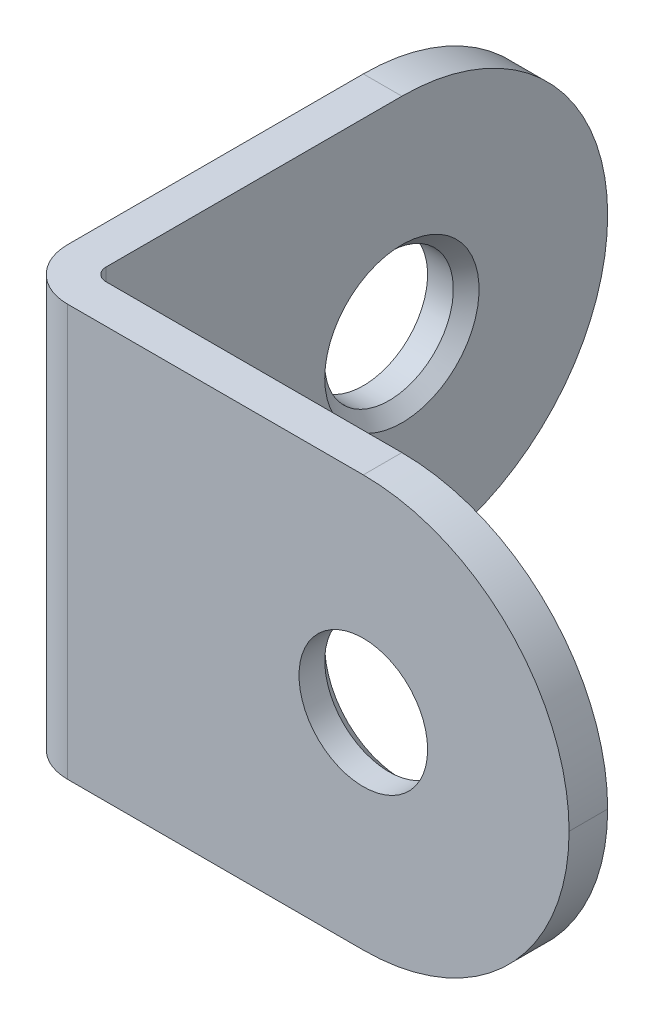
ISO-10303-21;
HEADER;
FILE_DESCRIPTION(('STEP AP214'),'2;1');
FILE_NAME('part.step','',(''),(''),'','','');
FILE_SCHEMA(('AUTOMOTIVE_DESIGN { 1 0 10303 214 1 1 1 1 }'));
ENDSEC;
DATA;
#1=APPLICATION_CONTEXT('core data for automotive mechanical design processes');
#2=APPLICATION_PROTOCOL_DEFINITION('international standard','automotive_design',2000,#1);
#3=PRODUCT_CONTEXT('',#1,'mechanical');
#4=PRODUCT('Part','Part','',(#3));
#5=PRODUCT_RELATED_PRODUCT_CATEGORY('part','',(#4));
#6=PRODUCT_DEFINITION_FORMATION('','',#4);
#7=PRODUCT_DEFINITION_CONTEXT('part definition',#1,'design');
#8=PRODUCT_DEFINITION('design','',#6,#7);
#9=PRODUCT_DEFINITION_SHAPE('','',#8);
#10=(LENGTH_UNIT() NAMED_UNIT(*) SI_UNIT(.MILLI.,.METRE.));
#11=(NAMED_UNIT(*) PLANE_ANGLE_UNIT() SI_UNIT($,.RADIAN.));
#12=(NAMED_UNIT(*) SI_UNIT($,.STERADIAN.) SOLID_ANGLE_UNIT());
#13=UNCERTAINTY_MEASURE_WITH_UNIT(LENGTH_MEASURE(1.E-05),#10,'distance_accuracy_value','');
#14=(GEOMETRIC_REPRESENTATION_CONTEXT(3) GLOBAL_UNCERTAINTY_ASSIGNED_CONTEXT((#13)) GLOBAL_UNIT_ASSIGNED_CONTEXT((#10,
#11,#12)) REPRESENTATION_CONTEXT('',''));
#15=CARTESIAN_POINT('',(0.,0.,0.));
#16=DIRECTION('',(0.,0.,1.));
#17=DIRECTION('',(1.,0.,0.));
#18=AXIS2_PLACEMENT_3D('',#15,#16,#17);
#19=CARTESIAN_POINT('',(-1.5,16.,-20.));
#20=DIRECTION('',(1.,0.,0.));
#21=DIRECTION('',(0.,0.,-1.));
#22=AXIS2_PLACEMENT_3D('',#19,#20,#21);
#23=PLANE('',#22);
#24=CARTESIAN_POINT('',(-1.5,8.,-12.));
#25=DIRECTION('',(-1.,0.,0.));
#26=DIRECTION('',(0.,0.,1.));
#27=AXIS2_PLACEMENT_3D('',#24,#25,#26);
#28=CIRCLE('',#27,2.5);
#29=CARTESIAN_POINT('',(-1.5,8.,-9.5));
#30=VERTEX_POINT('',#29);
#31=EDGE_CURVE('E312',#30,#30,#28,.T.);
#32=ORIENTED_EDGE('',*,*,#31,.F.);
#33=EDGE_LOOP('',(#32));
#34=FACE_BOUND('',#33,.T.);
#35=DIRECTION('',(0.,0.,1.));
#36=VECTOR('',#35,1.);
#37=CARTESIAN_POINT('',(-1.5,0.,-20.));
#38=LINE('',#37,#36);
#39=CARTESIAN_POINT('',(-1.5,0.,-12.));
#40=VERTEX_POINT('',#39);
#41=CARTESIAN_POINT('',(-1.5,0.,-0.5));
#42=VERTEX_POINT('',#41);
#43=EDGE_CURVE('E127',#40,#42,#38,.T.);
#44=ORIENTED_EDGE('',*,*,#43,.T.);
#45=DIRECTION('',(0.,-1.,0.));
#46=VECTOR('',#45,1.);
#47=CARTESIAN_POINT('',(-1.5,16.,-0.5));
#48=LINE('',#47,#46);
#49=CARTESIAN_POINT('',(-1.5,16.,-0.5));
#50=VERTEX_POINT('',#49);
#51=EDGE_CURVE('E195',#42,#50,#48,.F.);
#52=ORIENTED_EDGE('',*,*,#51,.T.);
#53=DIRECTION('',(0.,0.,1.));
#54=VECTOR('',#53,1.);
#55=CARTESIAN_POINT('',(-1.5,16.,-20.));
#56=LINE('',#55,#54);
#57=CARTESIAN_POINT('',(-1.5,16.,-12.));
#58=VERTEX_POINT('',#57);
#59=EDGE_CURVE('E303',#58,#50,#56,.T.);
#60=ORIENTED_EDGE('',*,*,#59,.F.);
#61=CARTESIAN_POINT('',(-1.5,8.,-12.));
#62=DIRECTION('',(1.,0.,0.));
#63=DIRECTION('',(0.,0.,-1.));
#64=AXIS2_PLACEMENT_3D('',#61,#62,#63);
#65=CIRCLE('',#64,8.);
#66=CARTESIAN_POINT('',(-1.5,8.,-20.));
#67=VERTEX_POINT('',#66);
#68=EDGE_CURVE('E131',#58,#67,#65,.F.);
#69=ORIENTED_EDGE('',*,*,#68,.T.);
#70=CARTESIAN_POINT('',(-1.5,8.,-12.));
#71=DIRECTION('',(1.,0.,0.));
#72=DIRECTION('',(0.,0.,-1.));
#73=AXIS2_PLACEMENT_3D('',#70,#71,#72);
#74=CIRCLE('',#73,8.);
#75=EDGE_CURVE('E125',#67,#40,#74,.F.);
#76=ORIENTED_EDGE('',*,*,#75,.T.);
#77=EDGE_LOOP('',(#44,#52,#60,#69,#76));
#78=FACE_BOUND('',#77,.T.);
#79=ADVANCED_FACE('F44',(#34,#78),#23,.F.);
#80=CARTESIAN_POINT('',(-1.5,16.,1.5));
#81=DIRECTION('',(0.,0.,-1.));
#82=DIRECTION('',(-1.,0.,0.));
#83=AXIS2_PLACEMENT_3D('',#80,#81,#82);
#84=PLANE('',#83);
#85=CARTESIAN_POINT('',(12.,8.,1.5));
#86=DIRECTION('',(0.,0.,1.));
#87=DIRECTION('',(1.,0.,0.));
#88=AXIS2_PLACEMENT_3D('',#85,#86,#87);
#89=CIRCLE('',#88,2.5);
#90=CARTESIAN_POINT('',(14.5,8.,1.5));
#91=VERTEX_POINT('',#90);
#92=EDGE_CURVE('E189',#91,#91,#89,.T.);
#93=ORIENTED_EDGE('',*,*,#92,.F.);
#94=EDGE_LOOP('',(#93));
#95=FACE_BOUND('',#94,.T.);
#96=DIRECTION('',(1.,0.,0.));
#97=VECTOR('',#96,1.);
#98=CARTESIAN_POINT('',(-1.5,16.,1.5));
#99=LINE('',#98,#97);
#100=CARTESIAN_POINT('',(0.499999999999998,16.,1.5));
#101=VERTEX_POINT('',#100);
#102=CARTESIAN_POINT('',(12.,16.,1.5));
#103=VERTEX_POINT('',#102);
#104=EDGE_CURVE('E292',#101,#103,#99,.T.);
#105=ORIENTED_EDGE('',*,*,#104,.F.);
#106=DIRECTION('',(0.,-1.,0.));
#107=VECTOR('',#106,1.);
#108=CARTESIAN_POINT('',(0.499999999999998,16.,1.5));
#109=LINE('',#108,#107);
#110=CARTESIAN_POINT('',(0.499999999999998,0.,1.5));
#111=VERTEX_POINT('',#110);
#112=EDGE_CURVE('E182',#101,#111,#109,.T.);
#113=ORIENTED_EDGE('',*,*,#112,.T.);
#114=DIRECTION('',(1.,0.,0.));
#115=VECTOR('',#114,1.);
#116=CARTESIAN_POINT('',(-1.5,0.,1.5));
#117=LINE('',#116,#115);
#118=CARTESIAN_POINT('',(12.,0.,1.5));
#119=VERTEX_POINT('',#118);
#120=EDGE_CURVE('E145',#111,#119,#117,.T.);
#121=ORIENTED_EDGE('',*,*,#120,.T.);
#122=CARTESIAN_POINT('',(12.,8.,1.5));
#123=DIRECTION('',(0.,0.,-1.));
#124=DIRECTION('',(-1.,0.,0.));
#125=AXIS2_PLACEMENT_3D('',#122,#123,#124);
#126=CIRCLE('',#125,8.);
#127=CARTESIAN_POINT('',(20.,8.,1.5));
#128=VERTEX_POINT('',#127);
#129=EDGE_CURVE('E179',#119,#128,#126,.F.);
#130=ORIENTED_EDGE('',*,*,#129,.T.);
#131=CARTESIAN_POINT('',(12.,8.,1.5));
#132=DIRECTION('',(0.,0.,-1.));
#133=DIRECTION('',(-1.,0.,0.));
#134=AXIS2_PLACEMENT_3D('',#131,#132,#133);
#135=CIRCLE('',#134,8.);
#136=EDGE_CURVE('E175',#128,#103,#135,.F.);
#137=ORIENTED_EDGE('',*,*,#136,.T.);
#138=EDGE_LOOP('',(#105,#113,#121,#130,#137));
#139=FACE_BOUND('',#138,.T.);
#140=ADVANCED_FACE('F235',(#95,#139),#84,.F.);
#141=CARTESIAN_POINT('',(0.,16.,0.));
#142=DIRECTION('',(0.,0.,1.));
#143=DIRECTION('',(1.,0.,0.));
#144=AXIS2_PLACEMENT_3D('',#141,#142,#143);
#145=PLANE('',#144);
#146=CARTESIAN_POINT('',(12.,8.,0.));
#147=DIRECTION('',(0.,0.,1.));
#148=DIRECTION('',(1.,0.,0.));
#149=AXIS2_PLACEMENT_3D('',#146,#147,#148);
#150=CIRCLE('',#149,3.);
#151=CARTESIAN_POINT('',(15.,8.,0.));
#152=VERTEX_POINT('',#151);
#153=EDGE_CURVE('E54',#152,#152,#150,.T.);
#154=ORIENTED_EDGE('',*,*,#153,.T.);
#155=EDGE_LOOP('',(#154));
#156=FACE_BOUND('',#155,.T.);
#157=DIRECTION('',(-1.,0.,0.));
#158=VECTOR('',#157,1.);
#159=CARTESIAN_POINT('',(0.,0.,0.));
#160=LINE('',#159,#158);
#161=CARTESIAN_POINT('',(12.,0.,0.));
#162=VERTEX_POINT('',#161);
#163=CARTESIAN_POINT('',(0.5,0.,0.));
#164=VERTEX_POINT('',#163);
#165=EDGE_CURVE('E298',#162,#164,#160,.T.);
#166=ORIENTED_EDGE('',*,*,#165,.T.);
#167=DIRECTION('',(0.,-1.,0.));
#168=VECTOR('',#167,1.);
#169=CARTESIAN_POINT('',(0.5,16.,0.));
#170=LINE('',#169,#168);
#171=CARTESIAN_POINT('',(0.5,16.,0.));
#172=VERTEX_POINT('',#171);
#173=EDGE_CURVE('E61',#164,#172,#170,.F.);
#174=ORIENTED_EDGE('',*,*,#173,.T.);
#175=DIRECTION('',(-1.,0.,0.));
#176=VECTOR('',#175,1.);
#177=CARTESIAN_POINT('',(0.,16.,0.));
#178=LINE('',#177,#176);
#179=CARTESIAN_POINT('',(12.,16.,0.));
#180=VERTEX_POINT('',#179);
#181=EDGE_CURVE('E282',#180,#172,#178,.T.);
#182=ORIENTED_EDGE('',*,*,#181,.F.);
#183=CARTESIAN_POINT('',(12.,8.,0.));
#184=DIRECTION('',(0.,0.,1.));
#185=DIRECTION('',(1.,0.,0.));
#186=AXIS2_PLACEMENT_3D('',#183,#184,#185);
#187=CIRCLE('',#186,8.);
#188=CARTESIAN_POINT('',(20.,8.,0.));
#189=VERTEX_POINT('',#188);
#190=EDGE_CURVE('E169',#180,#189,#187,.F.);
#191=ORIENTED_EDGE('',*,*,#190,.T.);
#192=CARTESIAN_POINT('',(12.,8.,0.));
#193=DIRECTION('',(0.,0.,1.));
#194=DIRECTION('',(1.,0.,0.));
#195=AXIS2_PLACEMENT_3D('',#192,#193,#194);
#196=CIRCLE('',#195,8.);
#197=EDGE_CURVE('E172',#189,#162,#196,.F.);
#198=ORIENTED_EDGE('',*,*,#197,.T.);
#199=EDGE_LOOP('',(#166,#174,#182,#191,#198));
#200=FACE_BOUND('',#199,.T.);
#201=ADVANCED_FACE('F223',(#156,#200),#145,.F.);
#202=CARTESIAN_POINT('',(0.,16.,-20.));
#203=DIRECTION('',(-1.,0.,0.));
#204=DIRECTION('',(0.,0.,1.));
#205=AXIS2_PLACEMENT_3D('',#202,#203,#204);
#206=PLANE('',#205);
#207=CARTESIAN_POINT('',(0.,8.,-12.));
#208=DIRECTION('',(-1.,0.,0.));
#209=DIRECTION('',(0.,0.,1.));
#210=AXIS2_PLACEMENT_3D('',#207,#208,#209);
#211=CIRCLE('',#210,2.99999999999999);
#212=CARTESIAN_POINT('',(0.,8.,-9.00000000000001));
#213=VERTEX_POINT('',#212);
#214=EDGE_CURVE('E212',#213,#213,#211,.T.);
#215=ORIENTED_EDGE('',*,*,#214,.T.);
#216=EDGE_LOOP('',(#215));
#217=FACE_BOUND('',#216,.T.);
#218=DIRECTION('',(0.,0.,-1.));
#219=VECTOR('',#218,1.);
#220=CARTESIAN_POINT('',(0.,16.,-20.));
#221=LINE('',#220,#219);
#222=CARTESIAN_POINT('',(0.,16.,-0.5));
#223=VERTEX_POINT('',#222);
#224=CARTESIAN_POINT('',(0.,16.,-12.));
#225=VERTEX_POINT('',#224);
#226=EDGE_CURVE('E281',#223,#225,#221,.T.);
#227=ORIENTED_EDGE('',*,*,#226,.F.);
#228=DIRECTION('',(0.,-1.,0.));
#229=VECTOR('',#228,1.);
#230=CARTESIAN_POINT('',(0.,0.,-0.5));
#231=LINE('',#230,#229);
#232=CARTESIAN_POINT('',(0.,0.,-0.5));
#233=VERTEX_POINT('',#232);
#234=EDGE_CURVE('E201',#223,#233,#231,.T.);
#235=ORIENTED_EDGE('',*,*,#234,.T.);
#236=DIRECTION('',(0.,0.,-1.));
#237=VECTOR('',#236,1.);
#238=CARTESIAN_POINT('',(0.,0.,-20.));
#239=LINE('',#238,#237);
#240=CARTESIAN_POINT('',(0.,0.,-12.));
#241=VERTEX_POINT('',#240);
#242=EDGE_CURVE('E301',#233,#241,#239,.T.);
#243=ORIENTED_EDGE('',*,*,#242,.T.);
#244=CARTESIAN_POINT('',(0.,8.,-12.));
#245=DIRECTION('',(-1.,0.,0.));
#246=DIRECTION('',(0.,0.,1.));
#247=AXIS2_PLACEMENT_3D('',#244,#245,#246);
#248=CIRCLE('',#247,8.);
#249=CARTESIAN_POINT('',(0.,8.,-20.));
#250=VERTEX_POINT('',#249);
#251=EDGE_CURVE('E150',#241,#250,#248,.F.);
#252=ORIENTED_EDGE('',*,*,#251,.T.);
#253=CARTESIAN_POINT('',(0.,8.,-12.));
#254=DIRECTION('',(-1.,0.,0.));
#255=DIRECTION('',(0.,0.,1.));
#256=AXIS2_PLACEMENT_3D('',#253,#254,#255);
#257=CIRCLE('',#256,8.);
#258=EDGE_CURVE('E152',#250,#225,#257,.F.);
#259=ORIENTED_EDGE('',*,*,#258,.T.);
#260=EDGE_LOOP('',(#227,#235,#243,#252,#259));
#261=FACE_BOUND('',#260,.T.);
#262=ADVANCED_FACE('F284',(#217,#261),#206,.F.);
#263=CARTESIAN_POINT('',(0.,16.,0.));
#264=DIRECTION('',(0.,-1.,0.));
#265=DIRECTION('',(0.,0.,-1.));
#266=AXIS2_PLACEMENT_3D('',#263,#264,#265);
#267=PLANE('',#266);
#268=ORIENTED_EDGE('',*,*,#59,.T.);
#269=CARTESIAN_POINT('',(0.499999999999998,16.,-0.5));
#270=DIRECTION('',(0.,-1.,0.));
#271=DIRECTION('',(0.,0.,-1.));
#272=AXIS2_PLACEMENT_3D('',#269,#270,#271);
#273=CIRCLE('',#272,2.);
#274=EDGE_CURVE('E198',#50,#101,#273,.F.);
#275=ORIENTED_EDGE('',*,*,#274,.T.);
#276=ORIENTED_EDGE('',*,*,#104,.T.);
#277=DIRECTION('',(0.,0.,-1.));
#278=VECTOR('',#277,1.);
#279=CARTESIAN_POINT('',(12.,16.,0.));
#280=LINE('',#279,#278);
#281=EDGE_CURVE('E163',#103,#180,#280,.T.);
#282=ORIENTED_EDGE('',*,*,#281,.T.);
#283=ORIENTED_EDGE('',*,*,#181,.T.);
#284=CARTESIAN_POINT('',(0.5,16.,-0.5));
#285=DIRECTION('',(0.,-1.,0.));
#286=DIRECTION('',(0.,0.,-1.));
#287=AXIS2_PLACEMENT_3D('',#284,#285,#286);
#288=CIRCLE('',#287,0.5);
#289=EDGE_CURVE('E209',#172,#223,#288,.T.);
#290=ORIENTED_EDGE('',*,*,#289,.T.);
#291=ORIENTED_EDGE('',*,*,#226,.T.);
#292=DIRECTION('',(-1.,0.,0.));
#293=VECTOR('',#292,1.);
#294=CARTESIAN_POINT('',(0.,16.,-12.));
#295=LINE('',#294,#293);
#296=EDGE_CURVE('E166',#225,#58,#295,.T.);
#297=ORIENTED_EDGE('',*,*,#296,.T.);
#298=EDGE_LOOP('',(#268,#275,#276,#282,#283,#290,#291,#297));
#299=FACE_BOUND('',#298,.T.);
#300=ADVANCED_FACE('F280',(#299),#267,.F.);
#301=CARTESIAN_POINT('',(0.,0.,0.));
#302=DIRECTION('',(0.,-1.,0.));
#303=DIRECTION('',(0.,0.,-1.));
#304=AXIS2_PLACEMENT_3D('',#301,#302,#303);
#305=PLANE('',#304);
#306=ORIENTED_EDGE('',*,*,#120,.F.);
#307=CARTESIAN_POINT('',(0.499999999999998,0.,-0.5));
#308=DIRECTION('',(0.,-1.,0.));
#309=DIRECTION('',(0.,0.,-1.));
#310=AXIS2_PLACEMENT_3D('',#307,#308,#309);
#311=CIRCLE('',#310,2.);
#312=EDGE_CURVE('E143',#111,#42,#311,.T.);
#313=ORIENTED_EDGE('',*,*,#312,.T.);
#314=ORIENTED_EDGE('',*,*,#43,.F.);
#315=DIRECTION('',(-1.,0.,0.));
#316=VECTOR('',#315,1.);
#317=CARTESIAN_POINT('',(0.,0.,-12.));
#318=LINE('',#317,#316);
#319=EDGE_CURVE('E142',#40,#241,#318,.F.);
#320=ORIENTED_EDGE('',*,*,#319,.T.);
#321=ORIENTED_EDGE('',*,*,#242,.F.);
#322=CARTESIAN_POINT('',(0.5,0.,-0.5));
#323=DIRECTION('',(0.,-1.,0.));
#324=DIRECTION('',(0.,0.,-1.));
#325=AXIS2_PLACEMENT_3D('',#322,#323,#324);
#326=CIRCLE('',#325,0.5);
#327=EDGE_CURVE('E69',#233,#164,#326,.F.);
#328=ORIENTED_EDGE('',*,*,#327,.T.);
#329=ORIENTED_EDGE('',*,*,#165,.F.);
#330=DIRECTION('',(0.,0.,-1.));
#331=VECTOR('',#330,1.);
#332=CARTESIAN_POINT('',(12.,0.,1.5));
#333=LINE('',#332,#331);
#334=EDGE_CURVE('E137',#162,#119,#333,.F.);
#335=ORIENTED_EDGE('',*,*,#334,.T.);
#336=EDGE_LOOP('',(#306,#313,#314,#320,#321,#328,#329,#335));
#337=FACE_BOUND('',#336,.T.);
#338=ADVANCED_FACE('F141',(#337),#305,.T.);
#339=CARTESIAN_POINT('',(0.,8.,-12.));
#340=DIRECTION('',(-1.,0.,0.));
#341=DIRECTION('',(0.,0.,1.));
#342=AXIS2_PLACEMENT_3D('',#339,#340,#341);
#343=CYLINDRICAL_SURFACE('',#342,8.);
#344=ORIENTED_EDGE('',*,*,#296,.F.);
#345=ORIENTED_EDGE('',*,*,#258,.F.);
#346=DIRECTION('',(-1.,0.,0.));
#347=VECTOR('',#346,1.);
#348=CARTESIAN_POINT('',(-1.5,8.,-20.));
#349=LINE('',#348,#347);
#350=EDGE_CURVE('E146',#67,#250,#349,.F.);
#351=ORIENTED_EDGE('',*,*,#350,.F.);
#352=ORIENTED_EDGE('',*,*,#68,.F.);
#353=EDGE_LOOP('',(#344,#345,#351,#352));
#354=FACE_BOUND('',#353,.T.);
#355=ADVANCED_FACE('F249',(#354),#343,.T.);
#356=CARTESIAN_POINT('',(-1.5,8.,-12.));
#357=DIRECTION('',(1.,0.,0.));
#358=DIRECTION('',(0.,0.,-1.));
#359=AXIS2_PLACEMENT_3D('',#356,#357,#358);
#360=CYLINDRICAL_SURFACE('',#359,8.);
#361=ORIENTED_EDGE('',*,*,#251,.F.);
#362=ORIENTED_EDGE('',*,*,#319,.F.);
#363=ORIENTED_EDGE('',*,*,#75,.F.);
#364=ORIENTED_EDGE('',*,*,#350,.T.);
#365=EDGE_LOOP('',(#361,#362,#363,#364));
#366=FACE_BOUND('',#365,.T.);
#367=ADVANCED_FACE('F149',(#366),#360,.T.);
#368=CARTESIAN_POINT('',(12.,8.,0.));
#369=DIRECTION('',(0.,0.,-1.));
#370=DIRECTION('',(-1.,0.,0.));
#371=AXIS2_PLACEMENT_3D('',#368,#369,#370);
#372=CYLINDRICAL_SURFACE('',#371,8.);
#373=ORIENTED_EDGE('',*,*,#281,.F.);
#374=ORIENTED_EDGE('',*,*,#136,.F.);
#375=DIRECTION('',(0.,0.,-1.));
#376=VECTOR('',#375,1.);
#377=CARTESIAN_POINT('',(20.,8.,0.));
#378=LINE('',#377,#376);
#379=EDGE_CURVE('E185',#189,#128,#378,.F.);
#380=ORIENTED_EDGE('',*,*,#379,.F.);
#381=ORIENTED_EDGE('',*,*,#190,.F.);
#382=EDGE_LOOP('',(#373,#374,#380,#381));
#383=FACE_BOUND('',#382,.T.);
#384=ADVANCED_FACE('F248',(#383),#372,.T.);
#385=CARTESIAN_POINT('',(12.,8.,0.));
#386=DIRECTION('',(0.,0.,1.));
#387=DIRECTION('',(1.,0.,0.));
#388=AXIS2_PLACEMENT_3D('',#385,#386,#387);
#389=CYLINDRICAL_SURFACE('',#388,8.);
#390=ORIENTED_EDGE('',*,*,#129,.F.);
#391=ORIENTED_EDGE('',*,*,#334,.F.);
#392=ORIENTED_EDGE('',*,*,#197,.F.);
#393=ORIENTED_EDGE('',*,*,#379,.T.);
#394=EDGE_LOOP('',(#390,#391,#392,#393));
#395=FACE_BOUND('',#394,.T.);
#396=ADVANCED_FACE('F253',(#395),#389,.T.);
#397=CARTESIAN_POINT('',(12.,8.,-14.5));
#398=DIRECTION('',(0.,0.,1.));
#399=DIRECTION('',(1.,0.,0.));
#400=AXIS2_PLACEMENT_3D('',#397,#398,#399);
#401=CYLINDRICAL_SURFACE('',#400,2.5);
#402=CARTESIAN_POINT('',(12.,8.,0.5));
#403=DIRECTION('',(0.,0.,1.));
#404=DIRECTION('',(1.,0.,0.));
#405=AXIS2_PLACEMENT_3D('',#402,#403,#404);
#406=CIRCLE('',#405,2.5);
#407=CARTESIAN_POINT('',(14.5,8.,0.5));
#408=VERTEX_POINT('',#407);
#409=EDGE_CURVE('E11',#408,#408,#406,.F.);
#410=ORIENTED_EDGE('',*,*,#409,.T.);
#411=EDGE_LOOP('',(#410));
#412=FACE_BOUND('',#411,.T.);
#413=ORIENTED_EDGE('',*,*,#92,.T.);
#414=EDGE_LOOP('',(#413));
#415=FACE_BOUND('',#414,.T.);
#416=ADVANCED_FACE('F256',(#412,#415),#401,.F.);
#417=CARTESIAN_POINT('',(14.5,8.,-12.));
#418=DIRECTION('',(-1.,0.,0.));
#419=DIRECTION('',(0.,0.,1.));
#420=AXIS2_PLACEMENT_3D('',#417,#418,#419);
#421=CYLINDRICAL_SURFACE('',#420,2.5);
#422=CARTESIAN_POINT('',(-0.499999999999994,8.,-12.));
#423=DIRECTION('',(-1.,0.,0.));
#424=DIRECTION('',(0.,0.,1.));
#425=AXIS2_PLACEMENT_3D('',#422,#423,#424);
#426=CIRCLE('',#425,2.5);
#427=CARTESIAN_POINT('',(-0.499999999999994,8.,-9.5));
#428=VERTEX_POINT('',#427);
#429=EDGE_CURVE('E216',#428,#428,#426,.F.);
#430=ORIENTED_EDGE('',*,*,#429,.T.);
#431=EDGE_LOOP('',(#430));
#432=FACE_BOUND('',#431,.T.);
#433=ORIENTED_EDGE('',*,*,#31,.T.);
#434=EDGE_LOOP('',(#433));
#435=FACE_BOUND('',#434,.T.);
#436=ADVANCED_FACE('F264',(#432,#435),#421,.F.);
#437=CARTESIAN_POINT('',(0.499999999999998,16.,-0.5));
#438=DIRECTION('',(0.,-1.,0.));
#439=DIRECTION('',(0.,0.,-1.));
#440=AXIS2_PLACEMENT_3D('',#437,#438,#439);
#441=CYLINDRICAL_SURFACE('',#440,2.);
#442=ORIENTED_EDGE('',*,*,#274,.F.);
#443=ORIENTED_EDGE('',*,*,#51,.F.);
#444=ORIENTED_EDGE('',*,*,#312,.F.);
#445=ORIENTED_EDGE('',*,*,#112,.F.);
#446=EDGE_LOOP('',(#442,#443,#444,#445));
#447=FACE_BOUND('',#446,.T.);
#448=ADVANCED_FACE('F261',(#447),#441,.T.);
#449=CARTESIAN_POINT('',(0.5,16.,-0.5));
#450=DIRECTION('',(0.,1.,0.));
#451=DIRECTION('',(0.,0.,1.));
#452=AXIS2_PLACEMENT_3D('',#449,#450,#451);
#453=CYLINDRICAL_SURFACE('',#452,0.5);
#454=ORIENTED_EDGE('',*,*,#289,.F.);
#455=ORIENTED_EDGE('',*,*,#173,.F.);
#456=ORIENTED_EDGE('',*,*,#327,.F.);
#457=ORIENTED_EDGE('',*,*,#234,.F.);
#458=EDGE_LOOP('',(#454,#455,#456,#457));
#459=FACE_BOUND('',#458,.T.);
#460=ADVANCED_FACE('F231',(#459),#453,.F.);
#461=CARTESIAN_POINT('',(0.,8.,-12.));
#462=DIRECTION('',(1.,0.,0.));
#463=DIRECTION('',(0.,0.,-1.));
#464=AXIS2_PLACEMENT_3D('',#461,#462,#463);
#465=CONICAL_SURFACE('',#464,3.,0.78539816339745);
#466=ORIENTED_EDGE('',*,*,#429,.F.);
#467=EDGE_LOOP('',(#466));
#468=FACE_BOUND('',#467,.T.);
#469=ORIENTED_EDGE('',*,*,#214,.F.);
#470=EDGE_LOOP('',(#469));
#471=FACE_BOUND('',#470,.T.);
#472=ADVANCED_FACE('F226',(#468,#471),#465,.F.);
#473=CARTESIAN_POINT('',(12.,8.,0.));
#474=DIRECTION('',(0.,0.,-1.));
#475=DIRECTION('',(-1.,0.,0.));
#476=AXIS2_PLACEMENT_3D('',#473,#474,#475);
#477=CONICAL_SURFACE('',#476,3.,0.785398163397447);
#478=ORIENTED_EDGE('',*,*,#409,.F.);
#479=EDGE_LOOP('',(#478));
#480=FACE_BOUND('',#479,.T.);
#481=ORIENTED_EDGE('',*,*,#153,.F.);
#482=EDGE_LOOP('',(#481));
#483=FACE_BOUND('',#482,.T.);
#484=ADVANCED_FACE('F47',(#480,#483),#477,.F.);
#485=CLOSED_SHELL('',(#79,#140,#201,#262,#300,#338,#355,#367,#384,#396,#416,#436,#448,#460,#472,#484));
#486=MANIFOLD_SOLID_BREP('B2',#485);
#487=ADVANCED_BREP_SHAPE_REPRESENTATION('',(#18,#486),#14);
#488=SHAPE_DEFINITION_REPRESENTATION(#9,#487);
ENDSEC;
END-ISO-10303-21;
